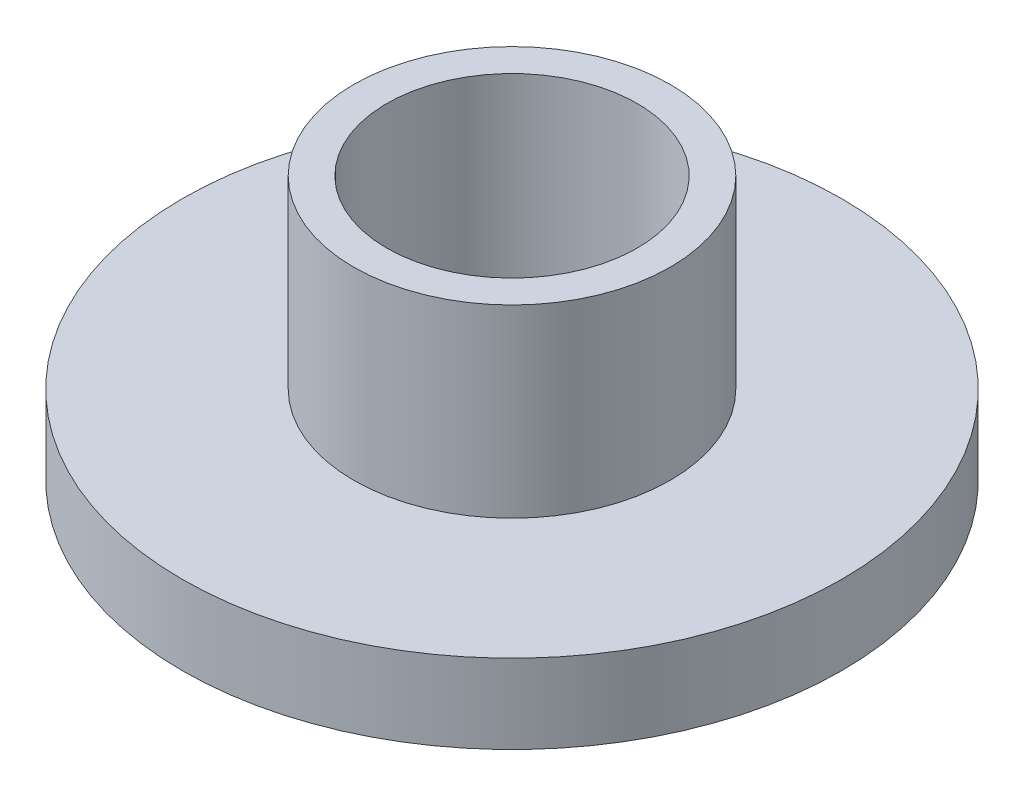
ISO-10303-21;
HEADER;
FILE_DESCRIPTION(('STEP AP214'),'2;1');
FILE_NAME('part.step','',(''),(''),'','','');
FILE_SCHEMA(('AUTOMOTIVE_DESIGN { 1 0 10303 214 1 1 1 1 }'));
ENDSEC;
DATA;
#1=APPLICATION_CONTEXT('core data for automotive mechanical design processes');
#2=APPLICATION_PROTOCOL_DEFINITION('international standard','automotive_design',2000,#1);
#3=PRODUCT_CONTEXT('',#1,'mechanical');
#4=PRODUCT('Part','Part','',(#3));
#5=PRODUCT_RELATED_PRODUCT_CATEGORY('part','',(#4));
#6=PRODUCT_DEFINITION_FORMATION('','',#4);
#7=PRODUCT_DEFINITION_CONTEXT('part definition',#1,'design');
#8=PRODUCT_DEFINITION('design','',#6,#7);
#9=PRODUCT_DEFINITION_SHAPE('','',#8);
#10=(LENGTH_UNIT() NAMED_UNIT(*) SI_UNIT(.MILLI.,.METRE.));
#11=(NAMED_UNIT(*) PLANE_ANGLE_UNIT() SI_UNIT($,.RADIAN.));
#12=(NAMED_UNIT(*) SI_UNIT($,.STERADIAN.) SOLID_ANGLE_UNIT());
#13=UNCERTAINTY_MEASURE_WITH_UNIT(LENGTH_MEASURE(1.E-05),#10,'distance_accuracy_value','');
#14=(GEOMETRIC_REPRESENTATION_CONTEXT(3) GLOBAL_UNCERTAINTY_ASSIGNED_CONTEXT((#13)) GLOBAL_UNIT_ASSIGNED_CONTEXT((#10,
#11,#12)) REPRESENTATION_CONTEXT('',''));
#15=CARTESIAN_POINT('',(0.,0.,0.));
#16=DIRECTION('',(0.,0.,1.));
#17=DIRECTION('',(1.,0.,0.));
#18=AXIS2_PLACEMENT_3D('',#15,#16,#17);
#19=CARTESIAN_POINT('',(0.,4.,0.));
#20=DIRECTION('',(0.,-1.,0.));
#21=DIRECTION('',(0.,0.,-1.));
#22=AXIS2_PLACEMENT_3D('',#19,#20,#21);
#23=CYLINDRICAL_SURFACE('',#22,5.);
#24=CARTESIAN_POINT('',(0.,0.,0.));
#25=DIRECTION('',(0.,1.,0.));
#26=DIRECTION('',(0.,0.,1.));
#27=AXIS2_PLACEMENT_3D('',#24,#25,#26);
#28=CIRCLE('',#27,5.);
#29=CARTESIAN_POINT('',(0.,0.,5.));
#30=VERTEX_POINT('',#29);
#31=EDGE_CURVE('E12',#30,#30,#28,.T.);
#32=ORIENTED_EDGE('',*,*,#31,.T.);
#33=EDGE_LOOP('',(#32));
#34=FACE_BOUND('',#33,.T.);
#35=CARTESIAN_POINT('',(0.,1.2,0.));
#36=DIRECTION('',(0.,1.,0.));
#37=DIRECTION('',(0.,0.,1.));
#38=AXIS2_PLACEMENT_3D('',#35,#36,#37);
#39=CIRCLE('',#38,5.);
#40=CARTESIAN_POINT('',(0.,1.2,5.));
#41=VERTEX_POINT('',#40);
#42=EDGE_CURVE('E37',#41,#41,#39,.T.);
#43=ORIENTED_EDGE('',*,*,#42,.F.);
#44=EDGE_LOOP('',(#43));
#45=FACE_BOUND('',#44,.T.);
#46=ADVANCED_FACE('F34',(#34,#45),#23,.T.);
#47=CARTESIAN_POINT('',(0.,4.,0.));
#48=DIRECTION('',(0.,1.,0.));
#49=DIRECTION('',(0.,0.,1.));
#50=AXIS2_PLACEMENT_3D('',#47,#48,#49);
#51=PLANE('',#50);
#52=CARTESIAN_POINT('',(0.,4.,0.));
#53=DIRECTION('',(0.,1.,0.));
#54=DIRECTION('',(0.,0.,1.));
#55=AXIS2_PLACEMENT_3D('',#52,#53,#54);
#56=CIRCLE('',#55,1.9);
#57=CARTESIAN_POINT('',(0.,4.,1.9));
#58=VERTEX_POINT('',#57);
#59=EDGE_CURVE('E45',#58,#58,#56,.T.);
#60=ORIENTED_EDGE('',*,*,#59,.F.);
#61=EDGE_LOOP('',(#60));
#62=FACE_BOUND('',#61,.T.);
#63=CARTESIAN_POINT('',(0.,4.,0.));
#64=DIRECTION('',(0.,1.,0.));
#65=DIRECTION('',(0.,0.,1.));
#66=AXIS2_PLACEMENT_3D('',#63,#64,#65);
#67=CIRCLE('',#66,2.4);
#68=CARTESIAN_POINT('',(0.,4.,2.4));
#69=VERTEX_POINT('',#68);
#70=EDGE_CURVE('E53',#69,#69,#67,.T.);
#71=ORIENTED_EDGE('',*,*,#70,.T.);
#72=EDGE_LOOP('',(#71));
#73=FACE_BOUND('',#72,.T.);
#74=ADVANCED_FACE('F57',(#62,#73),#51,.T.);
#75=CARTESIAN_POINT('',(0.,0.,0.));
#76=DIRECTION('',(0.,1.,0.));
#77=DIRECTION('',(0.,0.,1.));
#78=AXIS2_PLACEMENT_3D('',#75,#76,#77);
#79=PLANE('',#78);
#80=CARTESIAN_POINT('',(0.,0.,0.));
#81=DIRECTION('',(0.,1.,0.));
#82=DIRECTION('',(0.,0.,1.));
#83=AXIS2_PLACEMENT_3D('',#80,#81,#82);
#84=CIRCLE('',#83,1.9);
#85=CARTESIAN_POINT('',(0.,0.,1.9));
#86=VERTEX_POINT('',#85);
#87=EDGE_CURVE('E41',#86,#86,#84,.T.);
#88=ORIENTED_EDGE('',*,*,#87,.T.);
#89=EDGE_LOOP('',(#88));
#90=FACE_BOUND('',#89,.T.);
#91=ORIENTED_EDGE('',*,*,#31,.F.);
#92=EDGE_LOOP('',(#91));
#93=FACE_BOUND('',#92,.T.);
#94=ADVANCED_FACE('F76',(#90,#93),#79,.F.);
#95=CARTESIAN_POINT('',(0.,0.,0.));
#96=DIRECTION('',(0.,1.,0.));
#97=DIRECTION('',(0.,0.,1.));
#98=AXIS2_PLACEMENT_3D('',#95,#96,#97);
#99=CYLINDRICAL_SURFACE('',#98,1.9);
#100=ORIENTED_EDGE('',*,*,#87,.F.);
#101=EDGE_LOOP('',(#100));
#102=FACE_BOUND('',#101,.T.);
#103=ORIENTED_EDGE('',*,*,#59,.T.);
#104=EDGE_LOOP('',(#103));
#105=FACE_BOUND('',#104,.T.);
#106=ADVANCED_FACE('F67',(#102,#105),#99,.F.);
#107=CARTESIAN_POINT('',(0.,1.2,0.));
#108=DIRECTION('',(0.,1.,0.));
#109=DIRECTION('',(0.,0.,1.));
#110=AXIS2_PLACEMENT_3D('',#107,#108,#109);
#111=PLANE('',#110);
#112=CARTESIAN_POINT('',(0.,1.2,0.));
#113=DIRECTION('',(0.,1.,0.));
#114=DIRECTION('',(0.,0.,1.));
#115=AXIS2_PLACEMENT_3D('',#112,#113,#114);
#116=CIRCLE('',#115,2.4);
#117=CARTESIAN_POINT('',(0.,1.2,2.4));
#118=VERTEX_POINT('',#117);
#119=EDGE_CURVE('E50',#118,#118,#116,.F.);
#120=ORIENTED_EDGE('',*,*,#119,.T.);
#121=EDGE_LOOP('',(#120));
#122=FACE_BOUND('',#121,.T.);
#123=ORIENTED_EDGE('',*,*,#42,.T.);
#124=EDGE_LOOP('',(#123));
#125=FACE_BOUND('',#124,.T.);
#126=ADVANCED_FACE('F61',(#122,#125),#111,.T.);
#127=CARTESIAN_POINT('',(0.,-14.2835569799683,0.));
#128=DIRECTION('',(0.,1.,0.));
#129=DIRECTION('',(0.,0.,1.));
#130=AXIS2_PLACEMENT_3D('',#127,#128,#129);
#131=CYLINDRICAL_SURFACE('',#130,2.4);
#132=CARTESIAN_POINT('',(0.,1.2,2.4));
#133=CARTESIAN_POINT('',(0.,1.22916666666666,2.4));
#134=CARTESIAN_POINT('',(0.,1.25833333333333,2.4));
#135=CARTESIAN_POINT('',(0.,1.31666666666667,2.4));
#136=CARTESIAN_POINT('',(0.,1.34583333333333,2.4));
#137=CARTESIAN_POINT('',(0.,1.40416666666666,2.4));
#138=CARTESIAN_POINT('',(0.,1.43333333333333,2.4));
#139=CARTESIAN_POINT('',(0.,1.49166666666666,2.4));
#140=CARTESIAN_POINT('',(0.,1.52083333333333,2.4));
#141=CARTESIAN_POINT('',(0.,1.57916666666666,2.4));
#142=CARTESIAN_POINT('',(0.,1.60833333333333,2.4));
#143=CARTESIAN_POINT('',(0.,1.66666666666666,2.4));
#144=CARTESIAN_POINT('',(0.,1.69583333333333,2.4));
#145=CARTESIAN_POINT('',(0.,1.75416666666666,2.4));
#146=CARTESIAN_POINT('',(0.,1.78333333333333,2.4));
#147=CARTESIAN_POINT('',(0.,1.84166666666666,2.4));
#148=CARTESIAN_POINT('',(0.,1.87083333333333,2.4));
#149=CARTESIAN_POINT('',(0.,1.92916666666666,2.4));
#150=CARTESIAN_POINT('',(0.,1.95833333333333,2.4));
#151=CARTESIAN_POINT('',(0.,2.01666666666666,2.4));
#152=CARTESIAN_POINT('',(0.,2.04583333333333,2.4));
#153=CARTESIAN_POINT('',(0.,2.10416666666666,2.4));
#154=CARTESIAN_POINT('',(0.,2.13333333333333,2.4));
#155=CARTESIAN_POINT('',(0.,2.19166666666666,2.4));
#156=CARTESIAN_POINT('',(0.,2.22083333333333,2.4));
#157=CARTESIAN_POINT('',(0.,2.27916666666667,2.4));
#158=CARTESIAN_POINT('',(0.,2.30833333333333,2.4));
#159=CARTESIAN_POINT('',(0.,2.36666666666666,2.4));
#160=CARTESIAN_POINT('',(0.,2.39583333333333,2.4));
#161=CARTESIAN_POINT('',(0.,2.45416666666666,2.4));
#162=CARTESIAN_POINT('',(0.,2.48333333333333,2.4));
#163=CARTESIAN_POINT('',(0.,2.54166666666666,2.4));
#164=CARTESIAN_POINT('',(0.,2.57083333333333,2.4));
#165=CARTESIAN_POINT('',(0.,2.62916666666667,2.4));
#166=CARTESIAN_POINT('',(0.,2.65833333333333,2.4));
#167=CARTESIAN_POINT('',(0.,2.71666666666667,2.4));
#168=CARTESIAN_POINT('',(0.,2.74583333333333,2.4));
#169=CARTESIAN_POINT('',(0.,2.80416666666667,2.4));
#170=CARTESIAN_POINT('',(0.,2.83333333333333,2.4));
#171=CARTESIAN_POINT('',(0.,2.89166666666666,2.4));
#172=CARTESIAN_POINT('',(0.,2.92083333333333,2.4));
#173=CARTESIAN_POINT('',(0.,2.97916666666666,2.4));
#174=CARTESIAN_POINT('',(0.,3.00833333333333,2.4));
#175=CARTESIAN_POINT('',(0.,3.06666666666667,2.4));
#176=CARTESIAN_POINT('',(0.,3.09583333333333,2.4));
#177=CARTESIAN_POINT('',(0.,3.15416666666667,2.4));
#178=CARTESIAN_POINT('',(0.,3.18333333333333,2.4));
#179=CARTESIAN_POINT('',(0.,3.24166666666667,2.4));
#180=CARTESIAN_POINT('',(0.,3.27083333333333,2.4));
#181=CARTESIAN_POINT('',(0.,3.32916666666667,2.4));
#182=CARTESIAN_POINT('',(0.,3.35833333333333,2.4));
#183=CARTESIAN_POINT('',(0.,3.41666666666667,2.4));
#184=CARTESIAN_POINT('',(0.,3.44583333333333,2.4));
#185=CARTESIAN_POINT('',(0.,3.50416666666667,2.4));
#186=CARTESIAN_POINT('',(0.,3.53333333333333,2.4));
#187=CARTESIAN_POINT('',(0.,3.59166666666667,2.4));
#188=CARTESIAN_POINT('',(0.,3.62083333333333,2.4));
#189=CARTESIAN_POINT('',(0.,3.67916666666667,2.4));
#190=CARTESIAN_POINT('',(0.,3.70833333333333,2.4));
#191=CARTESIAN_POINT('',(0.,3.76666666666667,2.4));
#192=CARTESIAN_POINT('',(0.,3.79583333333333,2.4));
#193=CARTESIAN_POINT('',(0.,3.85416666666667,2.4));
#194=CARTESIAN_POINT('',(0.,3.88333333333333,2.4));
#195=CARTESIAN_POINT('',(0.,3.94166666666667,2.4));
#196=CARTESIAN_POINT('',(0.,3.97083333333333,2.4));
#197=CARTESIAN_POINT('',(0.,4.,2.4));
#198=B_SPLINE_CURVE_WITH_KNOTS('',3,(#132,#133,#134,#135,#136,#137,#138,#139,#140,#141,#142,
#143,#144,#145,#146,#147,#148,#149,#150,#151,#152,#153,#154,#155,#156,#157,#158,#159,#160,#161,
#162,#163,#164,#165,#166,#167,#168,#169,#170,#171,#172,#173,#174,#175,#176,#177,#178,#179,#180,
#181,#182,#183,#184,#185,#186,#187,#188,#189,#190,#191,#192,#193,#194,#195,#196,#197),
.UNSPECIFIED.,.F.,.F.,(4,2,2,2,2,2,2,2,2,2,2,2,2,2,2,2,2,2,2,2,2,2,2,2,2,2,2,2,2,2,2,2,4),(0.,
0.0875000000000008,0.175,0.262499999999997,0.349999999999998,0.437499999999999,
0.524999999999999,0.6125,0.699999999999998,0.787499999999998,0.874999999999999,0.9625,1.05,
1.1375,1.225,1.3125,1.4,1.4875,1.575,1.6625,1.75,1.8375,1.925,2.0125,2.1,2.1875,2.275,2.3625,
2.45,2.5375,2.625,2.7125,2.8),.UNSPECIFIED.);
#199=EDGE_CURVE('BSEAM59',#118,#69,#198,.T.);
#200=ORIENTED_EDGE('',*,*,#119,.F.);
#201=ORIENTED_EDGE('',*,*,#70,.F.);
#202=ORIENTED_EDGE('',*,*,#199,.T.);
#203=ORIENTED_EDGE('',*,*,#199,.F.);
#204=EDGE_LOOP('',(#200,#202,#201,#203));
#205=FACE_BOUND('',#204,.T.);
#206=ADVANCED_FACE('F59',(#205),#131,.T.);
#207=CLOSED_SHELL('',(#46,#74,#94,#106,#126,#206));
#208=MANIFOLD_SOLID_BREP('B2',#207);
#209=ADVANCED_BREP_SHAPE_REPRESENTATION('',(#18,#208),#14);
#210=SHAPE_DEFINITION_REPRESENTATION(#9,#209);
ENDSEC;
END-ISO-10303-21;
